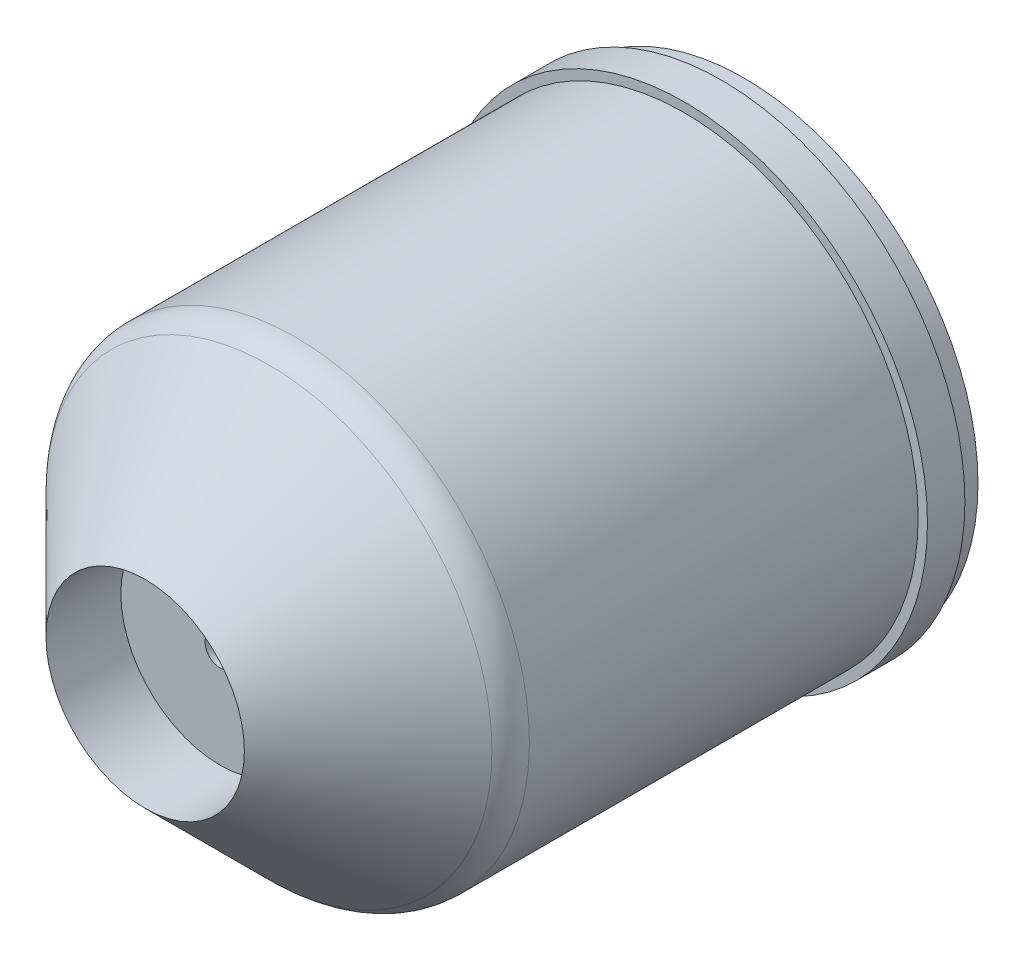
ISO-10303-21;
HEADER;
FILE_DESCRIPTION(('STEP AP214'),'2;1');
FILE_NAME('part.step','',(''),(''),'','','');
FILE_SCHEMA(('AUTOMOTIVE_DESIGN { 1 0 10303 214 1 1 1 1 }'));
ENDSEC;
DATA;
#1=APPLICATION_CONTEXT('core data for automotive mechanical design processes');
#2=APPLICATION_PROTOCOL_DEFINITION('international standard','automotive_design',2000,#1);
#3=PRODUCT_CONTEXT('',#1,'mechanical');
#4=PRODUCT('Part','Part','',(#3));
#5=PRODUCT_RELATED_PRODUCT_CATEGORY('part','',(#4));
#6=PRODUCT_DEFINITION_FORMATION('','',#4);
#7=PRODUCT_DEFINITION_CONTEXT('part definition',#1,'design');
#8=PRODUCT_DEFINITION('design','',#6,#7);
#9=PRODUCT_DEFINITION_SHAPE('','',#8);
#10=(LENGTH_UNIT() NAMED_UNIT(*) SI_UNIT(.MILLI.,.METRE.));
#11=(NAMED_UNIT(*) PLANE_ANGLE_UNIT() SI_UNIT($,.RADIAN.));
#12=(NAMED_UNIT(*) SI_UNIT($,.STERADIAN.) SOLID_ANGLE_UNIT());
#13=UNCERTAINTY_MEASURE_WITH_UNIT(LENGTH_MEASURE(1.E-05),#10,'distance_accuracy_value','');
#14=(GEOMETRIC_REPRESENTATION_CONTEXT(3) GLOBAL_UNCERTAINTY_ASSIGNED_CONTEXT((#13)) GLOBAL_UNIT_ASSIGNED_CONTEXT((#10,
#11,#12)) REPRESENTATION_CONTEXT('',''));
#15=CARTESIAN_POINT('',(0.,0.,0.));
#16=DIRECTION('',(0.,0.,1.));
#17=DIRECTION('',(1.,0.,0.));
#18=AXIS2_PLACEMENT_3D('',#15,#16,#17);
#19=CARTESIAN_POINT('',(0.,0.,80.));
#20=DIRECTION('',(0.,0.,-1.));
#21=DIRECTION('',(-1.,0.,0.));
#22=AXIS2_PLACEMENT_3D('',#19,#20,#21);
#23=CYLINDRICAL_SURFACE('',#22,31.25);
#24=CARTESIAN_POINT('',(0.,0.,59.9289321881345));
#25=DIRECTION('',(0.,0.,1.));
#26=DIRECTION('',(1.,0.,0.));
#27=AXIS2_PLACEMENT_3D('',#24,#25,#26);
#28=CIRCLE('',#27,31.25);
#29=CARTESIAN_POINT('',(31.25,0.,59.9289321881345));
#30=VERTEX_POINT('',#29);
#31=EDGE_CURVE('E45',#30,#30,#28,.F.);
#32=ORIENTED_EDGE('',*,*,#31,.T.);
#33=EDGE_LOOP('',(#32));
#34=FACE_BOUND('',#33,.T.);
#35=CARTESIAN_POINT('',(0.,0.,7.99999999999999));
#36=DIRECTION('',(0.,0.,1.));
#37=DIRECTION('',(1.,0.,0.));
#38=AXIS2_PLACEMENT_3D('',#35,#36,#37);
#39=CIRCLE('',#38,31.25);
#40=CARTESIAN_POINT('',(31.25,0.,7.99999999999999));
#41=VERTEX_POINT('',#40);
#42=EDGE_CURVE('E83',#41,#41,#39,.T.);
#43=ORIENTED_EDGE('',*,*,#42,.T.);
#44=EDGE_LOOP('',(#43));
#45=FACE_BOUND('',#44,.T.);
#46=ADVANCED_FACE('F37',(#34,#45),#23,.T.);
#47=CARTESIAN_POINT('',(0.,0.,8.));
#48=DIRECTION('',(0.,0.,-1.));
#49=DIRECTION('',(-1.,0.,0.));
#50=AXIS2_PLACEMENT_3D('',#47,#48,#49);
#51=CYLINDRICAL_SURFACE('',#50,32.5);
#52=CARTESIAN_POINT('',(0.,0.,8.));
#53=DIRECTION('',(0.,0.,1.));
#54=DIRECTION('',(1.,0.,0.));
#55=AXIS2_PLACEMENT_3D('',#52,#53,#54);
#56=CIRCLE('',#55,32.5);
#57=CARTESIAN_POINT('',(32.5,0.,8.));
#58=VERTEX_POINT('',#57);
#59=EDGE_CURVE('E80',#58,#58,#56,.T.);
#60=ORIENTED_EDGE('',*,*,#59,.F.);
#61=EDGE_LOOP('',(#60));
#62=FACE_BOUND('',#61,.T.);
#63=CARTESIAN_POINT('',(0.,0.,3.));
#64=DIRECTION('',(0.,0.,1.));
#65=DIRECTION('',(1.,0.,0.));
#66=AXIS2_PLACEMENT_3D('',#63,#64,#65);
#67=CIRCLE('',#66,32.5);
#68=CARTESIAN_POINT('',(32.5,0.,3.));
#69=VERTEX_POINT('',#68);
#70=EDGE_CURVE('E77',#69,#69,#67,.T.);
#71=ORIENTED_EDGE('',*,*,#70,.T.);
#72=EDGE_LOOP('',(#71));
#73=FACE_BOUND('',#72,.T.);
#74=ADVANCED_FACE('F98',(#62,#73),#51,.T.);
#75=CARTESIAN_POINT('',(0.,0.,8.));
#76=DIRECTION('',(0.,0.,1.));
#77=DIRECTION('',(1.,0.,0.));
#78=AXIS2_PLACEMENT_3D('',#75,#76,#77);
#79=PLANE('',#78);
#80=ORIENTED_EDGE('',*,*,#42,.F.);
#81=EDGE_LOOP('',(#80));
#82=FACE_BOUND('',#81,.T.);
#83=ORIENTED_EDGE('',*,*,#59,.T.);
#84=EDGE_LOOP('',(#83));
#85=FACE_BOUND('',#84,.T.);
#86=ADVANCED_FACE('F94',(#82,#85),#79,.T.);
#87=CARTESIAN_POINT('',(0.,0.,3.));
#88=DIRECTION('',(0.,0.,1.));
#89=DIRECTION('',(1.,0.,0.));
#90=AXIS2_PLACEMENT_3D('',#87,#88,#89);
#91=PLANE('',#90);
#92=CARTESIAN_POINT('',(0.,0.,3.));
#93=DIRECTION('',(0.,0.,1.));
#94=DIRECTION('',(1.,0.,0.));
#95=AXIS2_PLACEMENT_3D('',#92,#93,#94);
#96=CIRCLE('',#95,31.25);
#97=CARTESIAN_POINT('',(31.25,0.,3.));
#98=VERTEX_POINT('',#97);
#99=EDGE_CURVE('E50',#98,#98,#96,.T.);
#100=ORIENTED_EDGE('',*,*,#99,.T.);
#101=EDGE_LOOP('',(#100));
#102=FACE_BOUND('',#101,.T.);
#103=ORIENTED_EDGE('',*,*,#70,.F.);
#104=EDGE_LOOP('',(#103));
#105=FACE_BOUND('',#104,.T.);
#106=ADVANCED_FACE('F97',(#102,#105),#91,.F.);
#107=CARTESIAN_POINT('',(0.,0.,0.));
#108=DIRECTION('',(0.,0.,1.));
#109=DIRECTION('',(1.,0.,0.));
#110=AXIS2_PLACEMENT_3D('',#107,#108,#109);
#111=PLANE('',#110);
#112=CARTESIAN_POINT('',(0.,0.,0.));
#113=DIRECTION('',(0.,0.,-1.));
#114=DIRECTION('',(-1.,0.,0.));
#115=AXIS2_PLACEMENT_3D('',#112,#113,#114);
#116=CIRCLE('',#115,28.75);
#117=CARTESIAN_POINT('',(-28.75,0.,0.));
#118=VERTEX_POINT('',#117);
#119=EDGE_CURVE('E59',#118,#118,#116,.T.);
#120=ORIENTED_EDGE('',*,*,#119,.F.);
#121=EDGE_LOOP('',(#120));
#122=FACE_BOUND('',#121,.T.);
#123=CARTESIAN_POINT('',(0.,0.,0.));
#124=DIRECTION('',(0.,0.,1.));
#125=DIRECTION('',(1.,0.,0.));
#126=AXIS2_PLACEMENT_3D('',#123,#124,#125);
#127=CIRCLE('',#126,31.25);
#128=CARTESIAN_POINT('',(31.25,0.,0.));
#129=VERTEX_POINT('',#128);
#130=EDGE_CURVE('E86',#129,#129,#127,.T.);
#131=ORIENTED_EDGE('',*,*,#130,.F.);
#132=EDGE_LOOP('',(#131));
#133=FACE_BOUND('',#132,.T.);
#134=ADVANCED_FACE('F108',(#122,#133),#111,.F.);
#135=ORIENTED_EDGE('',*,*,#130,.T.);
#136=EDGE_LOOP('',(#135));
#137=FACE_BOUND('',#136,.T.);
#138=ORIENTED_EDGE('',*,*,#99,.F.);
#139=EDGE_LOOP('',(#138));
#140=FACE_BOUND('',#139,.T.);
#141=ADVANCED_FACE('F114',(#137,#140),#23,.T.);
#142=CARTESIAN_POINT('',(0.,0.,80.));
#143=DIRECTION('',(0.,0.,-1.));
#144=DIRECTION('',(-1.,0.,0.));
#145=AXIS2_PLACEMENT_3D('',#142,#143,#144);
#146=CONICAL_SURFACE('',#145,13.25,0.785398163397447);
#147=CARTESIAN_POINT('',(0.,0.,63.4644660940672));
#148=DIRECTION('',(0.,0.,-1.));
#149=DIRECTION('',(-1.,0.,0.));
#150=AXIS2_PLACEMENT_3D('',#147,#148,#149);
#151=CIRCLE('',#150,29.7855339059327);
#152=CARTESIAN_POINT('',(-29.7855339059327,0.,63.4644660940672));
#153=VERTEX_POINT('',#152);
#154=EDGE_CURVE('E10',#153,#153,#151,.F.);
#155=ORIENTED_EDGE('',*,*,#154,.T.);
#156=EDGE_LOOP('',(#155));
#157=FACE_BOUND('',#156,.T.);
#158=CARTESIAN_POINT('',(0.,0.,80.));
#159=DIRECTION('',(0.,0.,1.));
#160=DIRECTION('',(1.,0.,0.));
#161=AXIS2_PLACEMENT_3D('',#158,#159,#160);
#162=CIRCLE('',#161,13.25);
#163=CARTESIAN_POINT('',(13.25,0.,80.));
#164=VERTEX_POINT('',#163);
#165=EDGE_CURVE('E71',#164,#164,#162,.T.);
#166=ORIENTED_EDGE('',*,*,#165,.F.);
#167=EDGE_LOOP('',(#166));
#168=FACE_BOUND('',#167,.T.);
#169=ADVANCED_FACE('F123',(#157,#168),#146,.T.);
#170=CARTESIAN_POINT('',(0.,0.,59.9289321881345));
#171=DIRECTION('',(0.,0.,1.));
#172=DIRECTION('',(1.,0.,0.));
#173=AXIS2_PLACEMENT_3D('',#170,#171,#172);
#174=TOROIDAL_SURFACE('',#173,26.25,5.);
#175=ORIENTED_EDGE('',*,*,#154,.F.);
#176=EDGE_LOOP('',(#175));
#177=FACE_BOUND('',#176,.T.);
#178=ORIENTED_EDGE('',*,*,#31,.F.);
#179=EDGE_LOOP('',(#178));
#180=FACE_BOUND('',#179,.T.);
#181=ADVANCED_FACE('F39',(#177,#180),#174,.T.);
#182=CARTESIAN_POINT('',(0.,0.,70.));
#183=DIRECTION('',(0.,0.,1.));
#184=DIRECTION('',(1.,0.,0.));
#185=AXIS2_PLACEMENT_3D('',#182,#183,#184);
#186=CYLINDRICAL_SURFACE('',#185,13.25);
#187=CARTESIAN_POINT('',(0.,0.,70.));
#188=DIRECTION('',(0.,0.,1.));
#189=DIRECTION('',(1.,0.,0.));
#190=AXIS2_PLACEMENT_3D('',#187,#188,#189);
#191=CIRCLE('',#190,13.25);
#192=CARTESIAN_POINT('',(13.25,0.,70.));
#193=VERTEX_POINT('',#192);
#194=EDGE_CURVE('E74',#193,#193,#191,.T.);
#195=ORIENTED_EDGE('',*,*,#194,.F.);
#196=EDGE_LOOP('',(#195));
#197=FACE_BOUND('',#196,.T.);
#198=ORIENTED_EDGE('',*,*,#165,.T.);
#199=EDGE_LOOP('',(#198));
#200=FACE_BOUND('',#199,.T.);
#201=ADVANCED_FACE('F135',(#197,#200),#186,.F.);
#202=CARTESIAN_POINT('',(0.,0.,70.));
#203=DIRECTION('',(0.,0.,1.));
#204=DIRECTION('',(1.,0.,0.));
#205=AXIS2_PLACEMENT_3D('',#202,#203,#204);
#206=PLANE('',#205);
#207=CARTESIAN_POINT('',(0.,0.,70.));
#208=DIRECTION('',(0.,0.,1.));
#209=DIRECTION('',(1.,0.,0.));
#210=AXIS2_PLACEMENT_3D('',#207,#208,#209);
#211=CIRCLE('',#210,2.);
#212=CARTESIAN_POINT('',(2.,0.,70.));
#213=VERTEX_POINT('',#212);
#214=EDGE_CURVE('E55',#213,#213,#211,.T.);
#215=ORIENTED_EDGE('',*,*,#214,.F.);
#216=EDGE_LOOP('',(#215));
#217=FACE_BOUND('',#216,.T.);
#218=CARTESIAN_POINT('',(8.09634677504652,0.,70.));
#219=DIRECTION('',(0.,0.,1.));
#220=DIRECTION('',(1.,0.,0.));
#221=AXIS2_PLACEMENT_3D('',#218,#219,#220);
#222=CIRCLE('',#221,2.5);
#223=CARTESIAN_POINT('',(10.5963467750465,0.,70.));
#224=VERTEX_POINT('',#223);
#225=EDGE_CURVE('E61',#224,#224,#222,.T.);
#226=ORIENTED_EDGE('',*,*,#225,.F.);
#227=EDGE_LOOP('',(#226));
#228=FACE_BOUND('',#227,.T.);
#229=ORIENTED_EDGE('',*,*,#194,.T.);
#230=EDGE_LOOP('',(#229));
#231=FACE_BOUND('',#230,.T.);
#232=ADVANCED_FACE('F144',(#217,#228,#231),#206,.T.);
#233=CARTESIAN_POINT('',(0.,0.,60.));
#234=DIRECTION('',(0.,0.,-1.));
#235=DIRECTION('',(-1.,0.,0.));
#236=AXIS2_PLACEMENT_3D('',#233,#234,#235);
#237=CYLINDRICAL_SURFACE('',#236,28.75);
#238=CARTESIAN_POINT('',(0.,0.,60.));
#239=DIRECTION('',(0.,0.,-1.));
#240=DIRECTION('',(-1.,0.,0.));
#241=AXIS2_PLACEMENT_3D('',#238,#239,#240);
#242=CIRCLE('',#241,28.75);
#243=CARTESIAN_POINT('',(-28.75,0.,60.));
#244=VERTEX_POINT('',#243);
#245=EDGE_CURVE('E68',#244,#244,#242,.T.);
#246=ORIENTED_EDGE('',*,*,#245,.F.);
#247=EDGE_LOOP('',(#246));
#248=FACE_BOUND('',#247,.T.);
#249=ORIENTED_EDGE('',*,*,#119,.T.);
#250=EDGE_LOOP('',(#249));
#251=FACE_BOUND('',#250,.T.);
#252=ADVANCED_FACE('F150',(#248,#251),#237,.F.);
#253=CARTESIAN_POINT('',(0.,0.,60.));
#254=DIRECTION('',(0.,0.,-1.));
#255=DIRECTION('',(-1.,0.,0.));
#256=AXIS2_PLACEMENT_3D('',#253,#254,#255);
#257=PLANE('',#256);
#258=CARTESIAN_POINT('',(0.,0.,60.));
#259=DIRECTION('',(0.,0.,-1.));
#260=DIRECTION('',(-1.,0.,0.));
#261=AXIS2_PLACEMENT_3D('',#258,#259,#260);
#262=CIRCLE('',#261,2.);
#263=CARTESIAN_POINT('',(-2.,0.,60.));
#264=VERTEX_POINT('',#263);
#265=EDGE_CURVE('E41',#264,#264,#262,.T.);
#266=ORIENTED_EDGE('',*,*,#265,.F.);
#267=EDGE_LOOP('',(#266));
#268=FACE_BOUND('',#267,.T.);
#269=CARTESIAN_POINT('',(8.09634677504652,0.,60.));
#270=DIRECTION('',(0.,0.,-1.));
#271=DIRECTION('',(-1.,0.,0.));
#272=AXIS2_PLACEMENT_3D('',#269,#270,#271);
#273=CIRCLE('',#272,2.5);
#274=CARTESIAN_POINT('',(5.59634677504652,0.,60.));
#275=VERTEX_POINT('',#274);
#276=EDGE_CURVE('E53',#275,#275,#273,.T.);
#277=ORIENTED_EDGE('',*,*,#276,.F.);
#278=EDGE_LOOP('',(#277));
#279=FACE_BOUND('',#278,.T.);
#280=ORIENTED_EDGE('',*,*,#245,.T.);
#281=EDGE_LOOP('',(#280));
#282=FACE_BOUND('',#281,.T.);
#283=ADVANCED_FACE('F157',(#268,#279,#282),#257,.T.);
#284=CARTESIAN_POINT('',(8.09634677504652,0.,0.));
#285=DIRECTION('',(0.,0.,1.));
#286=DIRECTION('',(1.,0.,0.));
#287=AXIS2_PLACEMENT_3D('',#284,#285,#286);
#288=CYLINDRICAL_SURFACE('',#287,2.5);
#289=ORIENTED_EDGE('',*,*,#276,.T.);
#290=EDGE_LOOP('',(#289));
#291=FACE_BOUND('',#290,.T.);
#292=ORIENTED_EDGE('',*,*,#225,.T.);
#293=EDGE_LOOP('',(#292));
#294=FACE_BOUND('',#293,.T.);
#295=ADVANCED_FACE('F161',(#291,#294),#288,.F.);
#296=CARTESIAN_POINT('',(0.,0.,0.));
#297=DIRECTION('',(0.,0.,1.));
#298=DIRECTION('',(1.,0.,0.));
#299=AXIS2_PLACEMENT_3D('',#296,#297,#298);
#300=CYLINDRICAL_SURFACE('',#299,2.);
#301=ORIENTED_EDGE('',*,*,#265,.T.);
#302=EDGE_LOOP('',(#301));
#303=FACE_BOUND('',#302,.T.);
#304=ORIENTED_EDGE('',*,*,#214,.T.);
#305=EDGE_LOOP('',(#304));
#306=FACE_BOUND('',#305,.T.);
#307=ADVANCED_FACE('F165',(#303,#306),#300,.F.);
#308=CLOSED_SHELL('',(#46,#74,#86,#106,#134,#141,#169,#181,#201,#232,#252,#283,#295,#307));
#309=MANIFOLD_SOLID_BREP('B2',#308);
#310=ADVANCED_BREP_SHAPE_REPRESENTATION('',(#18,#309),#14);
#311=SHAPE_DEFINITION_REPRESENTATION(#9,#310);
ENDSEC;
END-ISO-10303-21;
